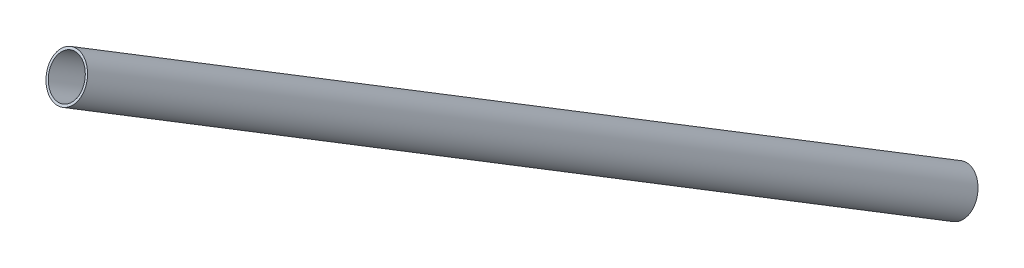
ISO-10303-21;
HEADER;
FILE_DESCRIPTION(('STEP AP214'),'2;1');
FILE_NAME('part.step','',(''),(''),'','','');
FILE_SCHEMA(('AUTOMOTIVE_DESIGN { 1 0 10303 214 1 1 1 1 }'));
ENDSEC;
DATA;
#1=APPLICATION_CONTEXT('core data for automotive mechanical design processes');
#2=APPLICATION_PROTOCOL_DEFINITION('international standard','automotive_design',2000,#1);
#3=PRODUCT_CONTEXT('',#1,'mechanical');
#4=PRODUCT('Part','Part','',(#3));
#5=PRODUCT_RELATED_PRODUCT_CATEGORY('part','',(#4));
#6=PRODUCT_DEFINITION_FORMATION('','',#4);
#7=PRODUCT_DEFINITION_CONTEXT('part definition',#1,'design');
#8=PRODUCT_DEFINITION('design','',#6,#7);
#9=PRODUCT_DEFINITION_SHAPE('','',#8);
#10=(LENGTH_UNIT() NAMED_UNIT(*) SI_UNIT(.MILLI.,.METRE.));
#11=(NAMED_UNIT(*) PLANE_ANGLE_UNIT() SI_UNIT($,.RADIAN.));
#12=(NAMED_UNIT(*) SI_UNIT($,.STERADIAN.) SOLID_ANGLE_UNIT());
#13=UNCERTAINTY_MEASURE_WITH_UNIT(LENGTH_MEASURE(1.E-05),#10,'distance_accuracy_value','');
#14=(GEOMETRIC_REPRESENTATION_CONTEXT(3) GLOBAL_UNCERTAINTY_ASSIGNED_CONTEXT((#13)) GLOBAL_UNIT_ASSIGNED_CONTEXT((#10,
#11,#12)) REPRESENTATION_CONTEXT('',''));
#15=CARTESIAN_POINT('',(0.,0.,0.));
#16=DIRECTION('',(0.,0.,1.));
#17=DIRECTION('',(1.,0.,0.));
#18=AXIS2_PLACEMENT_3D('',#15,#16,#17);
#19=CARTESIAN_POINT('',(-150.,0.,-825.));
#20=DIRECTION('',(-0.173785333909047,0.463427557090794,0.868926669545238));
#21=DIRECTION('',(0.,-0.882352941176471,0.470588235294118));
#22=AXIS2_PLACEMENT_3D('',#19,#20,#21);
#23=CYLINDRICAL_SURFACE('',#22,9.79999999999998);
#24=CARTESIAN_POINT('',(-150.,0.,-825.));
#25=DIRECTION('',(0.173785333909047,-0.463427557090794,-0.868926669545238));
#26=DIRECTION('',(0.643417681150066,-0.614550747865215,0.456443935091461));
#27=AXIS2_PLACEMENT_3D('',#24,#25,#26);
#28=CIRCLE('',#27,9.79999999999998);
#29=CARTESIAN_POINT('',(-143.694506724729,-6.02259732907915,-820.526849436104));
#30=VERTEX_POINT('',#29);
#31=EDGE_CURVE('E46',#30,#30,#28,.T.);
#32=ORIENTED_EDGE('',*,*,#31,.T.);
#33=EDGE_LOOP('',(#32));
#34=FACE_BOUND('',#33,.T.);
#35=CARTESIAN_POINT('',(-225.,200.,-450.));
#36=DIRECTION('',(0.173785333909047,-0.463427557090794,-0.868926669545238));
#37=DIRECTION('',(0.643417681150066,-0.614550747865215,0.456443935091461));
#38=AXIS2_PLACEMENT_3D('',#35,#36,#37);
#39=CIRCLE('',#38,9.79999999999998);
#40=CARTESIAN_POINT('',(-218.694506724729,193.977402670921,-445.526849436104));
#41=VERTEX_POINT('',#40);
#42=EDGE_CURVE('E52',#41,#41,#39,.T.);
#43=ORIENTED_EDGE('',*,*,#42,.F.);
#44=EDGE_LOOP('',(#43));
#45=FACE_BOUND('',#44,.T.);
#46=ADVANCED_FACE('F39',(#34,#45),#23,.F.);
#47=CARTESIAN_POINT('',(-150.,0.,-825.));
#48=DIRECTION('',(-0.173785333909047,0.463427557090794,0.868926669545238));
#49=DIRECTION('',(0.,-0.882352941176471,0.470588235294118));
#50=AXIS2_PLACEMENT_3D('',#47,#48,#49);
#51=CYLINDRICAL_SURFACE('',#50,11.);
#52=CARTESIAN_POINT('',(-150.,0.,-825.));
#53=DIRECTION('',(0.173785333909047,-0.463427557090794,-0.868926669545238));
#54=DIRECTION('',(0.643417681150066,-0.614550747865215,0.456443935091461));
#55=AXIS2_PLACEMENT_3D('',#52,#53,#54);
#56=CIRCLE('',#55,11.);
#57=CARTESIAN_POINT('',(-142.922405507349,-6.76005822651742,-819.979116713994));
#58=VERTEX_POINT('',#57);
#59=EDGE_CURVE('E10',#58,#58,#56,.T.);
#60=ORIENTED_EDGE('',*,*,#59,.F.);
#61=EDGE_LOOP('',(#60));
#62=FACE_BOUND('',#61,.T.);
#63=CARTESIAN_POINT('',(-225.,200.,-450.));
#64=DIRECTION('',(0.173785333909047,-0.463427557090794,-0.868926669545238));
#65=DIRECTION('',(0.643417681150066,-0.614550747865215,0.456443935091461));
#66=AXIS2_PLACEMENT_3D('',#63,#64,#65);
#67=CIRCLE('',#66,11.);
#68=CARTESIAN_POINT('',(-217.922405507349,193.239941773483,-444.979116713994));
#69=VERTEX_POINT('',#68);
#70=EDGE_CURVE('E42',#69,#69,#67,.T.);
#71=ORIENTED_EDGE('',*,*,#70,.T.);
#72=EDGE_LOOP('',(#71));
#73=FACE_BOUND('',#72,.T.);
#74=ADVANCED_FACE('F59',(#62,#73),#51,.T.);
#75=CARTESIAN_POINT('',(-150.,0.,-825.));
#76=DIRECTION('',(0.173785333909047,-0.463427557090794,-0.868926669545238));
#77=DIRECTION('',(0.643417681150066,-0.614550747865215,0.456443935091461));
#78=AXIS2_PLACEMENT_3D('',#75,#76,#77);
#79=PLANE('',#78);
#80=ORIENTED_EDGE('',*,*,#31,.F.);
#81=EDGE_LOOP('',(#80));
#82=FACE_BOUND('',#81,.T.);
#83=ORIENTED_EDGE('',*,*,#59,.T.);
#84=EDGE_LOOP('',(#83));
#85=FACE_BOUND('',#84,.T.);
#86=ADVANCED_FACE('F63',(#82,#85),#79,.T.);
#87=CARTESIAN_POINT('',(-225.,200.,-450.));
#88=DIRECTION('',(0.173785333909047,-0.463427557090794,-0.868926669545238));
#89=DIRECTION('',(0.643417681150066,-0.614550747865215,0.456443935091461));
#90=AXIS2_PLACEMENT_3D('',#87,#88,#89);
#91=PLANE('',#90);
#92=ORIENTED_EDGE('',*,*,#42,.T.);
#93=EDGE_LOOP('',(#92));
#94=FACE_BOUND('',#93,.T.);
#95=ORIENTED_EDGE('',*,*,#70,.F.);
#96=EDGE_LOOP('',(#95));
#97=FACE_BOUND('',#96,.T.);
#98=ADVANCED_FACE('F61',(#94,#97),#91,.F.);
#99=CLOSED_SHELL('',(#46,#74,#86,#98));
#100=MANIFOLD_SOLID_BREP('B2',#99);
#101=ADVANCED_BREP_SHAPE_REPRESENTATION('',(#18,#100),#14);
#102=SHAPE_DEFINITION_REPRESENTATION(#9,#101);
ENDSEC;
END-ISO-10303-21;
